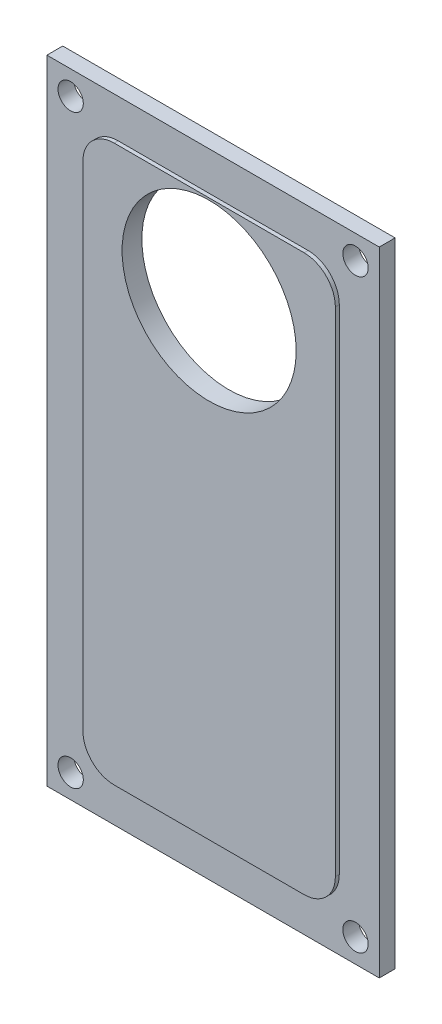
ISO-10303-21;
HEADER;
FILE_DESCRIPTION(('STEP AP214'),'2;1');
FILE_NAME('part.step','',(''),(''),'','','');
FILE_SCHEMA(('AUTOMOTIVE_DESIGN { 1 0 10303 214 1 1 1 1 }'));
ENDSEC;
DATA;
#1=APPLICATION_CONTEXT('core data for automotive mechanical design processes');
#2=APPLICATION_PROTOCOL_DEFINITION('international standard','automotive_design',2000,#1);
#3=PRODUCT_CONTEXT('',#1,'mechanical');
#4=PRODUCT('Part','Part','',(#3));
#5=PRODUCT_RELATED_PRODUCT_CATEGORY('part','',(#4));
#6=PRODUCT_DEFINITION_FORMATION('','',#4);
#7=PRODUCT_DEFINITION_CONTEXT('part definition',#1,'design');
#8=PRODUCT_DEFINITION('design','',#6,#7);
#9=PRODUCT_DEFINITION_SHAPE('','',#8);
#10=(LENGTH_UNIT() NAMED_UNIT(*) SI_UNIT(.MILLI.,.METRE.));
#11=(NAMED_UNIT(*) PLANE_ANGLE_UNIT() SI_UNIT($,.RADIAN.));
#12=(NAMED_UNIT(*) SI_UNIT($,.STERADIAN.) SOLID_ANGLE_UNIT());
#13=UNCERTAINTY_MEASURE_WITH_UNIT(LENGTH_MEASURE(1.E-05),#10,'distance_accuracy_value','');
#14=(GEOMETRIC_REPRESENTATION_CONTEXT(3) GLOBAL_UNCERTAINTY_ASSIGNED_CONTEXT((#13)) GLOBAL_UNIT_ASSIGNED_CONTEXT((#10,
#11,#12)) REPRESENTATION_CONTEXT('',''));
#15=CARTESIAN_POINT('',(0.,0.,0.));
#16=DIRECTION('',(0.,0.,1.));
#17=DIRECTION('',(1.,0.,0.));
#18=AXIS2_PLACEMENT_3D('',#15,#16,#17);
#19=CARTESIAN_POINT('',(21.,40.,2.));
#20=DIRECTION('',(-1.,0.,0.));
#21=DIRECTION('',(0.,-1.,0.));
#22=AXIS2_PLACEMENT_3D('',#19,#20,#21);
#23=PLANE('',#22);
#24=DIRECTION('',(0.,1.,0.));
#25=VECTOR('',#24,1.);
#26=CARTESIAN_POINT('',(21.,40.,0.));
#27=LINE('',#26,#25);
#28=CARTESIAN_POINT('',(21.,-40.,0.));
#29=VERTEX_POINT('',#28);
#30=CARTESIAN_POINT('',(21.,40.,0.));
#31=VERTEX_POINT('',#30);
#32=EDGE_CURVE('E152',#29,#31,#27,.T.);
#33=ORIENTED_EDGE('',*,*,#32,.T.);
#34=DIRECTION('',(0.,0.,-1.));
#35=VECTOR('',#34,1.);
#36=CARTESIAN_POINT('',(21.,40.,2.));
#37=LINE('',#36,#35);
#38=CARTESIAN_POINT('',(21.,40.,2.));
#39=VERTEX_POINT('',#38);
#40=EDGE_CURVE('E131',#39,#31,#37,.T.);
#41=ORIENTED_EDGE('',*,*,#40,.F.);
#42=DIRECTION('',(0.,1.,0.));
#43=VECTOR('',#42,1.);
#44=CARTESIAN_POINT('',(21.,40.,2.));
#45=LINE('',#44,#43);
#46=CARTESIAN_POINT('',(21.,-40.,2.));
#47=VERTEX_POINT('',#46);
#48=EDGE_CURVE('E139',#47,#39,#45,.T.);
#49=ORIENTED_EDGE('',*,*,#48,.F.);
#50=DIRECTION('',(0.,0.,-1.));
#51=VECTOR('',#50,1.);
#52=CARTESIAN_POINT('',(21.,-40.,2.));
#53=LINE('',#52,#51);
#54=EDGE_CURVE('E257',#47,#29,#53,.T.);
#55=ORIENTED_EDGE('',*,*,#54,.T.);
#56=EDGE_LOOP('',(#33,#41,#49,#55));
#57=FACE_BOUND('',#56,.T.);
#58=ADVANCED_FACE('F38',(#57),#23,.F.);
#59=CARTESIAN_POINT('',(-21.,40.,2.));
#60=DIRECTION('',(0.,-1.,0.));
#61=DIRECTION('',(0.,0.,-1.));
#62=AXIS2_PLACEMENT_3D('',#59,#60,#61);
#63=PLANE('',#62);
#64=DIRECTION('',(-1.,0.,0.));
#65=VECTOR('',#64,1.);
#66=CARTESIAN_POINT('',(-21.,40.,0.));
#67=LINE('',#66,#65);
#68=CARTESIAN_POINT('',(-21.,40.,0.));
#69=VERTEX_POINT('',#68);
#70=EDGE_CURVE('E260',#31,#69,#67,.T.);
#71=ORIENTED_EDGE('',*,*,#70,.T.);
#72=DIRECTION('',(0.,0.,-1.));
#73=VECTOR('',#72,1.);
#74=CARTESIAN_POINT('',(-21.,40.,2.));
#75=LINE('',#74,#73);
#76=CARTESIAN_POINT('',(-21.,40.,2.));
#77=VERTEX_POINT('',#76);
#78=EDGE_CURVE('E134',#77,#69,#75,.T.);
#79=ORIENTED_EDGE('',*,*,#78,.F.);
#80=DIRECTION('',(-1.,0.,0.));
#81=VECTOR('',#80,1.);
#82=CARTESIAN_POINT('',(-21.,40.,2.));
#83=LINE('',#82,#81);
#84=EDGE_CURVE('E127',#39,#77,#83,.T.);
#85=ORIENTED_EDGE('',*,*,#84,.F.);
#86=ORIENTED_EDGE('',*,*,#40,.T.);
#87=EDGE_LOOP('',(#71,#79,#85,#86));
#88=FACE_BOUND('',#87,.T.);
#89=ADVANCED_FACE('F129',(#88),#63,.F.);
#90=CARTESIAN_POINT('',(-21.,40.,2.));
#91=DIRECTION('',(1.,0.,0.));
#92=DIRECTION('',(0.,1.,0.));
#93=AXIS2_PLACEMENT_3D('',#90,#91,#92);
#94=PLANE('',#93);
#95=DIRECTION('',(0.,-1.,0.));
#96=VECTOR('',#95,1.);
#97=CARTESIAN_POINT('',(-21.,40.,0.));
#98=LINE('',#97,#96);
#99=CARTESIAN_POINT('',(-21.,-40.,0.));
#100=VERTEX_POINT('',#99);
#101=EDGE_CURVE('E263',#69,#100,#98,.T.);
#102=ORIENTED_EDGE('',*,*,#101,.T.);
#103=DIRECTION('',(0.,0.,-1.));
#104=VECTOR('',#103,1.);
#105=CARTESIAN_POINT('',(-21.,-40.,2.));
#106=LINE('',#105,#104);
#107=CARTESIAN_POINT('',(-21.,-40.,2.));
#108=VERTEX_POINT('',#107);
#109=EDGE_CURVE('E160',#108,#100,#106,.T.);
#110=ORIENTED_EDGE('',*,*,#109,.F.);
#111=DIRECTION('',(0.,-1.,0.));
#112=VECTOR('',#111,1.);
#113=CARTESIAN_POINT('',(-21.,40.,2.));
#114=LINE('',#113,#112);
#115=EDGE_CURVE('E138',#77,#108,#114,.T.);
#116=ORIENTED_EDGE('',*,*,#115,.F.);
#117=ORIENTED_EDGE('',*,*,#78,.T.);
#118=EDGE_LOOP('',(#102,#110,#116,#117));
#119=FACE_BOUND('',#118,.T.);
#120=ADVANCED_FACE('F279',(#119),#94,.F.);
#121=CARTESIAN_POINT('',(-21.,-40.,2.));
#122=DIRECTION('',(0.,1.,0.));
#123=DIRECTION('',(0.,0.,1.));
#124=AXIS2_PLACEMENT_3D('',#121,#122,#123);
#125=PLANE('',#124);
#126=DIRECTION('',(1.,0.,0.));
#127=VECTOR('',#126,1.);
#128=CARTESIAN_POINT('',(-21.,-40.,0.));
#129=LINE('',#128,#127);
#130=EDGE_CURVE('E149',#100,#29,#129,.T.);
#131=ORIENTED_EDGE('',*,*,#130,.T.);
#132=ORIENTED_EDGE('',*,*,#54,.F.);
#133=DIRECTION('',(1.,0.,0.));
#134=VECTOR('',#133,1.);
#135=CARTESIAN_POINT('',(-21.,-40.,2.));
#136=LINE('',#135,#134);
#137=EDGE_CURVE('E144',#108,#47,#136,.T.);
#138=ORIENTED_EDGE('',*,*,#137,.F.);
#139=ORIENTED_EDGE('',*,*,#109,.T.);
#140=EDGE_LOOP('',(#131,#132,#138,#139));
#141=FACE_BOUND('',#140,.T.);
#142=ADVANCED_FACE('F274',(#141),#125,.F.);
#143=CARTESIAN_POINT('',(0.,0.,2.));
#144=DIRECTION('',(0.,0.,1.));
#145=DIRECTION('',(1.,0.,0.));
#146=AXIS2_PLACEMENT_3D('',#143,#144,#145);
#147=PLANE('',#146);
#148=CARTESIAN_POINT('',(-18.,-37.,2.));
#149=DIRECTION('',(0.,0.,1.));
#150=DIRECTION('',(1.,0.,0.));
#151=AXIS2_PLACEMENT_3D('',#148,#149,#150);
#152=CIRCLE('',#151,1.6);
#153=CARTESIAN_POINT('',(-16.4,-37.,2.));
#154=VERTEX_POINT('',#153);
#155=EDGE_CURVE('E369',#154,#154,#152,.T.);
#156=ORIENTED_EDGE('',*,*,#155,.F.);
#157=EDGE_LOOP('',(#156));
#158=FACE_BOUND('',#157,.T.);
#159=CARTESIAN_POINT('',(18.,-37.,2.));
#160=DIRECTION('',(0.,0.,1.));
#161=DIRECTION('',(1.,0.,0.));
#162=AXIS2_PLACEMENT_3D('',#159,#160,#161);
#163=CIRCLE('',#162,1.6);
#164=CARTESIAN_POINT('',(19.6,-37.,2.));
#165=VERTEX_POINT('',#164);
#166=EDGE_CURVE('E374',#165,#165,#163,.T.);
#167=ORIENTED_EDGE('',*,*,#166,.F.);
#168=EDGE_LOOP('',(#167));
#169=FACE_BOUND('',#168,.T.);
#170=CARTESIAN_POINT('',(18.,37.,2.));
#171=DIRECTION('',(0.,0.,1.));
#172=DIRECTION('',(1.,0.,0.));
#173=AXIS2_PLACEMENT_3D('',#170,#171,#172);
#174=CIRCLE('',#173,1.6);
#175=CARTESIAN_POINT('',(19.6,37.,2.));
#176=VERTEX_POINT('',#175);
#177=EDGE_CURVE('E378',#176,#176,#174,.T.);
#178=ORIENTED_EDGE('',*,*,#177,.F.);
#179=EDGE_LOOP('',(#178));
#180=FACE_BOUND('',#179,.T.);
#181=CARTESIAN_POINT('',(-18.,37.,2.));
#182=DIRECTION('',(0.,0.,1.));
#183=DIRECTION('',(1.,0.,0.));
#184=AXIS2_PLACEMENT_3D('',#181,#182,#183);
#185=CIRCLE('',#184,1.6);
#186=CARTESIAN_POINT('',(-16.4,37.,2.));
#187=VERTEX_POINT('',#186);
#188=EDGE_CURVE('E382',#187,#187,#185,.T.);
#189=ORIENTED_EDGE('',*,*,#188,.F.);
#190=EDGE_LOOP('',(#189));
#191=FACE_BOUND('',#190,.T.);
#192=DIRECTION('',(0.,1.,0.));
#193=VECTOR('',#192,1.);
#194=CARTESIAN_POINT('',(15.95,35.125,2.));
#195=LINE('',#194,#193);
#196=CARTESIAN_POINT('',(15.95,-31.175,2.));
#197=VERTEX_POINT('',#196);
#198=CARTESIAN_POINT('',(15.95,31.175,2.));
#199=VERTEX_POINT('',#198);
#200=EDGE_CURVE('E207',#197,#199,#195,.T.);
#201=ORIENTED_EDGE('',*,*,#200,.F.);
#202=CARTESIAN_POINT('',(12.,-31.175,2.));
#203=DIRECTION('',(0.,0.,1.));
#204=DIRECTION('',(1.,0.,0.));
#205=AXIS2_PLACEMENT_3D('',#202,#203,#204);
#206=CIRCLE('',#205,3.95);
#207=CARTESIAN_POINT('',(12.,-35.125,2.));
#208=VERTEX_POINT('',#207);
#209=EDGE_CURVE('E199',#197,#208,#206,.F.);
#210=ORIENTED_EDGE('',*,*,#209,.T.);
#211=DIRECTION('',(1.,0.,0.));
#212=VECTOR('',#211,1.);
#213=CARTESIAN_POINT('',(-15.95,-35.125,2.));
#214=LINE('',#213,#212);
#215=CARTESIAN_POINT('',(-12.,-35.125,2.));
#216=VERTEX_POINT('',#215);
#217=EDGE_CURVE('E238',#216,#208,#214,.T.);
#218=ORIENTED_EDGE('',*,*,#217,.F.);
#219=CARTESIAN_POINT('',(-12.,-31.175,2.));
#220=DIRECTION('',(0.,0.,1.));
#221=DIRECTION('',(1.,0.,0.));
#222=AXIS2_PLACEMENT_3D('',#219,#220,#221);
#223=CIRCLE('',#222,3.95);
#224=CARTESIAN_POINT('',(-15.95,-31.175,2.));
#225=VERTEX_POINT('',#224);
#226=EDGE_CURVE('E202',#216,#225,#223,.F.);
#227=ORIENTED_EDGE('',*,*,#226,.T.);
#228=DIRECTION('',(0.,-1.,0.));
#229=VECTOR('',#228,1.);
#230=CARTESIAN_POINT('',(-15.95,35.125,2.));
#231=LINE('',#230,#229);
#232=CARTESIAN_POINT('',(-15.95,31.175,2.));
#233=VERTEX_POINT('',#232);
#234=EDGE_CURVE('E246',#233,#225,#231,.T.);
#235=ORIENTED_EDGE('',*,*,#234,.F.);
#236=CARTESIAN_POINT('',(-12.,31.175,2.));
#237=DIRECTION('',(0.,0.,1.));
#238=DIRECTION('',(1.,0.,0.));
#239=AXIS2_PLACEMENT_3D('',#236,#237,#238);
#240=CIRCLE('',#239,3.95);
#241=CARTESIAN_POINT('',(-12.,35.125,2.));
#242=VERTEX_POINT('',#241);
#243=EDGE_CURVE('E11',#233,#242,#240,.F.);
#244=ORIENTED_EDGE('',*,*,#243,.T.);
#245=DIRECTION('',(-1.,0.,0.));
#246=VECTOR('',#245,1.);
#247=CARTESIAN_POINT('',(-15.95,35.125,2.));
#248=LINE('',#247,#246);
#249=CARTESIAN_POINT('',(12.,35.125,2.));
#250=VERTEX_POINT('',#249);
#251=EDGE_CURVE('E208',#250,#242,#248,.T.);
#252=ORIENTED_EDGE('',*,*,#251,.F.);
#253=CARTESIAN_POINT('',(12.,31.175,2.));
#254=DIRECTION('',(0.,0.,1.));
#255=DIRECTION('',(1.,0.,0.));
#256=AXIS2_PLACEMENT_3D('',#253,#254,#255);
#257=CIRCLE('',#256,3.95);
#258=EDGE_CURVE('E47',#250,#199,#257,.F.);
#259=ORIENTED_EDGE('',*,*,#258,.T.);
#260=EDGE_LOOP('',(#201,#210,#218,#227,#235,#244,#252,#259));
#261=FACE_BOUND('',#260,.T.);
#262=ORIENTED_EDGE('',*,*,#48,.T.);
#263=ORIENTED_EDGE('',*,*,#84,.T.);
#264=ORIENTED_EDGE('',*,*,#115,.T.);
#265=ORIENTED_EDGE('',*,*,#137,.T.);
#266=EDGE_LOOP('',(#262,#263,#264,#265));
#267=FACE_BOUND('',#266,.T.);
#268=ADVANCED_FACE('F142',(#158,#169,#180,#191,#261,#267),#147,.T.);
#269=CARTESIAN_POINT('',(0.,0.,0.));
#270=DIRECTION('',(0.,0.,1.));
#271=DIRECTION('',(1.,0.,0.));
#272=AXIS2_PLACEMENT_3D('',#269,#270,#271);
#273=PLANE('',#272);
#274=CARTESIAN_POINT('',(-18.,-37.,0.));
#275=DIRECTION('',(0.,0.,-1.));
#276=DIRECTION('',(-1.,0.,0.));
#277=AXIS2_PLACEMENT_3D('',#274,#275,#276);
#278=CIRCLE('',#277,1.6);
#279=CARTESIAN_POINT('',(-19.6,-37.,0.));
#280=VERTEX_POINT('',#279);
#281=EDGE_CURVE('E349',#280,#280,#278,.T.);
#282=ORIENTED_EDGE('',*,*,#281,.F.);
#283=EDGE_LOOP('',(#282));
#284=FACE_BOUND('',#283,.T.);
#285=CARTESIAN_POINT('',(18.,-37.,0.));
#286=DIRECTION('',(0.,0.,-1.));
#287=DIRECTION('',(-1.,0.,0.));
#288=AXIS2_PLACEMENT_3D('',#285,#286,#287);
#289=CIRCLE('',#288,1.6);
#290=CARTESIAN_POINT('',(16.4,-37.,0.));
#291=VERTEX_POINT('',#290);
#292=EDGE_CURVE('E353',#291,#291,#289,.T.);
#293=ORIENTED_EDGE('',*,*,#292,.F.);
#294=EDGE_LOOP('',(#293));
#295=FACE_BOUND('',#294,.T.);
#296=CARTESIAN_POINT('',(18.,37.,0.));
#297=DIRECTION('',(0.,0.,-1.));
#298=DIRECTION('',(-1.,0.,0.));
#299=AXIS2_PLACEMENT_3D('',#296,#297,#298);
#300=CIRCLE('',#299,1.6);
#301=CARTESIAN_POINT('',(16.4,37.,0.));
#302=VERTEX_POINT('',#301);
#303=EDGE_CURVE('E357',#302,#302,#300,.T.);
#304=ORIENTED_EDGE('',*,*,#303,.F.);
#305=EDGE_LOOP('',(#304));
#306=FACE_BOUND('',#305,.T.);
#307=CARTESIAN_POINT('',(-18.,37.,0.));
#308=DIRECTION('',(0.,0.,-1.));
#309=DIRECTION('',(-1.,0.,0.));
#310=AXIS2_PLACEMENT_3D('',#307,#308,#309);
#311=CIRCLE('',#310,1.6);
#312=CARTESIAN_POINT('',(-19.6,37.,0.));
#313=VERTEX_POINT('',#312);
#314=EDGE_CURVE('E361',#313,#313,#311,.T.);
#315=ORIENTED_EDGE('',*,*,#314,.F.);
#316=EDGE_LOOP('',(#315));
#317=FACE_BOUND('',#316,.T.);
#318=CARTESIAN_POINT('',(0.,23.875,0.));
#319=DIRECTION('',(0.,0.,1.));
#320=DIRECTION('',(1.,0.,0.));
#321=AXIS2_PLACEMENT_3D('',#318,#319,#320);
#322=CIRCLE('',#321,11.);
#323=CARTESIAN_POINT('',(11.,23.875,0.));
#324=VERTEX_POINT('',#323);
#325=EDGE_CURVE('E215',#324,#324,#322,.T.);
#326=ORIENTED_EDGE('',*,*,#325,.T.);
#327=EDGE_LOOP('',(#326));
#328=FACE_BOUND('',#327,.T.);
#329=ORIENTED_EDGE('',*,*,#32,.F.);
#330=ORIENTED_EDGE('',*,*,#130,.F.);
#331=ORIENTED_EDGE('',*,*,#101,.F.);
#332=ORIENTED_EDGE('',*,*,#70,.F.);
#333=EDGE_LOOP('',(#329,#330,#331,#332));
#334=FACE_BOUND('',#333,.T.);
#335=ADVANCED_FACE('F278',(#284,#295,#306,#317,#328,#334),#273,.F.);
#336=CARTESIAN_POINT('',(15.95,35.125,2.5));
#337=DIRECTION('',(-1.,0.,0.));
#338=DIRECTION('',(0.,-1.,0.));
#339=AXIS2_PLACEMENT_3D('',#336,#337,#338);
#340=PLANE('',#339);
#341=DIRECTION('',(0.,1.,0.));
#342=VECTOR('',#341,1.);
#343=CARTESIAN_POINT('',(15.95,35.125,2.5));
#344=LINE('',#343,#342);
#345=CARTESIAN_POINT('',(15.95,-31.175,2.5));
#346=VERTEX_POINT('',#345);
#347=CARTESIAN_POINT('',(15.95,31.175,2.5));
#348=VERTEX_POINT('',#347);
#349=EDGE_CURVE('E226',#346,#348,#344,.T.);
#350=ORIENTED_EDGE('',*,*,#349,.F.);
#351=DIRECTION('',(0.,0.,-1.));
#352=VECTOR('',#351,1.);
#353=CARTESIAN_POINT('',(15.95,-31.175,2.5));
#354=LINE('',#353,#352);
#355=EDGE_CURVE('E158',#346,#197,#354,.T.);
#356=ORIENTED_EDGE('',*,*,#355,.T.);
#357=ORIENTED_EDGE('',*,*,#200,.T.);
#358=DIRECTION('',(0.,0.,-1.));
#359=VECTOR('',#358,1.);
#360=CARTESIAN_POINT('',(15.95,31.175,2.5));
#361=LINE('',#360,#359);
#362=EDGE_CURVE('E154',#199,#348,#361,.F.);
#363=ORIENTED_EDGE('',*,*,#362,.T.);
#364=EDGE_LOOP('',(#350,#356,#357,#363));
#365=FACE_BOUND('',#364,.T.);
#366=ADVANCED_FACE('F211',(#365),#340,.F.);
#367=CARTESIAN_POINT('',(-15.95,35.125,2.5));
#368=DIRECTION('',(0.,-1.,0.));
#369=DIRECTION('',(0.,0.,-1.));
#370=AXIS2_PLACEMENT_3D('',#367,#368,#369);
#371=PLANE('',#370);
#372=DIRECTION('',(-1.,0.,0.));
#373=VECTOR('',#372,1.);
#374=CARTESIAN_POINT('',(-15.95,35.125,2.5));
#375=LINE('',#374,#373);
#376=CARTESIAN_POINT('',(12.,35.125,2.5));
#377=VERTEX_POINT('',#376);
#378=CARTESIAN_POINT('',(-12.,35.125,2.5));
#379=VERTEX_POINT('',#378);
#380=EDGE_CURVE('E224',#377,#379,#375,.T.);
#381=ORIENTED_EDGE('',*,*,#380,.F.);
#382=DIRECTION('',(0.,0.,-1.));
#383=VECTOR('',#382,1.);
#384=CARTESIAN_POINT('',(12.,35.125,2.5));
#385=LINE('',#384,#383);
#386=EDGE_CURVE('E196',#377,#250,#385,.T.);
#387=ORIENTED_EDGE('',*,*,#386,.T.);
#388=ORIENTED_EDGE('',*,*,#251,.T.);
#389=DIRECTION('',(0.,0.,-1.));
#390=VECTOR('',#389,1.);
#391=CARTESIAN_POINT('',(-12.,35.125,2.5));
#392=LINE('',#391,#390);
#393=EDGE_CURVE('E193',#242,#379,#392,.F.);
#394=ORIENTED_EDGE('',*,*,#393,.T.);
#395=EDGE_LOOP('',(#381,#387,#388,#394));
#396=FACE_BOUND('',#395,.T.);
#397=ADVANCED_FACE('F228',(#396),#371,.F.);
#398=CARTESIAN_POINT('',(-15.95,35.125,2.5));
#399=DIRECTION('',(1.,0.,0.));
#400=DIRECTION('',(0.,1.,0.));
#401=AXIS2_PLACEMENT_3D('',#398,#399,#400);
#402=PLANE('',#401);
#403=ORIENTED_EDGE('',*,*,#234,.T.);
#404=DIRECTION('',(0.,0.,-1.));
#405=VECTOR('',#404,1.);
#406=CARTESIAN_POINT('',(-15.95,-31.175,2.5));
#407=LINE('',#406,#405);
#408=CARTESIAN_POINT('',(-15.95,-31.175,2.5));
#409=VERTEX_POINT('',#408);
#410=EDGE_CURVE('E190',#225,#409,#407,.F.);
#411=ORIENTED_EDGE('',*,*,#410,.T.);
#412=DIRECTION('',(0.,-1.,0.));
#413=VECTOR('',#412,1.);
#414=CARTESIAN_POINT('',(-15.95,35.125,2.5));
#415=LINE('',#414,#413);
#416=CARTESIAN_POINT('',(-15.95,31.175,2.5));
#417=VERTEX_POINT('',#416);
#418=EDGE_CURVE('E231',#417,#409,#415,.T.);
#419=ORIENTED_EDGE('',*,*,#418,.F.);
#420=DIRECTION('',(0.,0.,-1.));
#421=VECTOR('',#420,1.);
#422=CARTESIAN_POINT('',(-15.95,31.175,2.5));
#423=LINE('',#422,#421);
#424=EDGE_CURVE('E186',#417,#233,#423,.T.);
#425=ORIENTED_EDGE('',*,*,#424,.T.);
#426=EDGE_LOOP('',(#403,#411,#419,#425));
#427=FACE_BOUND('',#426,.T.);
#428=ADVANCED_FACE('F316',(#427),#402,.F.);
#429=CARTESIAN_POINT('',(-15.95,-35.125,2.5));
#430=DIRECTION('',(0.,1.,0.));
#431=DIRECTION('',(0.,0.,1.));
#432=AXIS2_PLACEMENT_3D('',#429,#430,#431);
#433=PLANE('',#432);
#434=ORIENTED_EDGE('',*,*,#217,.T.);
#435=DIRECTION('',(0.,0.,-1.));
#436=VECTOR('',#435,1.);
#437=CARTESIAN_POINT('',(12.,-35.125,2.5));
#438=LINE('',#437,#436);
#439=CARTESIAN_POINT('',(12.,-35.125,2.5));
#440=VERTEX_POINT('',#439);
#441=EDGE_CURVE('E171',#208,#440,#438,.F.);
#442=ORIENTED_EDGE('',*,*,#441,.T.);
#443=DIRECTION('',(1.,0.,0.));
#444=VECTOR('',#443,1.);
#445=CARTESIAN_POINT('',(-15.95,-35.125,2.5));
#446=LINE('',#445,#444);
#447=CARTESIAN_POINT('',(-12.,-35.125,2.5));
#448=VERTEX_POINT('',#447);
#449=EDGE_CURVE('E236',#448,#440,#446,.T.);
#450=ORIENTED_EDGE('',*,*,#449,.F.);
#451=DIRECTION('',(0.,0.,-1.));
#452=VECTOR('',#451,1.);
#453=CARTESIAN_POINT('',(-12.,-35.125,2.5));
#454=LINE('',#453,#452);
#455=EDGE_CURVE('E167',#448,#216,#454,.T.);
#456=ORIENTED_EDGE('',*,*,#455,.T.);
#457=EDGE_LOOP('',(#434,#442,#450,#456));
#458=FACE_BOUND('',#457,.T.);
#459=ADVANCED_FACE('F322',(#458),#433,.F.);
#460=CARTESIAN_POINT('',(0.,0.,2.5));
#461=DIRECTION('',(0.,0.,1.));
#462=DIRECTION('',(1.,0.,0.));
#463=AXIS2_PLACEMENT_3D('',#460,#461,#462);
#464=PLANE('',#463);
#465=CARTESIAN_POINT('',(0.,23.875,2.5));
#466=DIRECTION('',(0.,0.,1.));
#467=DIRECTION('',(1.,0.,0.));
#468=AXIS2_PLACEMENT_3D('',#465,#466,#467);
#469=CIRCLE('',#468,11.);
#470=CARTESIAN_POINT('',(11.,23.875,2.5));
#471=VERTEX_POINT('',#470);
#472=EDGE_CURVE('E365',#471,#471,#469,.T.);
#473=ORIENTED_EDGE('',*,*,#472,.F.);
#474=EDGE_LOOP('',(#473));
#475=FACE_BOUND('',#474,.T.);
#476=ORIENTED_EDGE('',*,*,#449,.T.);
#477=CARTESIAN_POINT('',(12.,-31.175,2.5));
#478=DIRECTION('',(0.,0.,1.));
#479=DIRECTION('',(1.,0.,0.));
#480=AXIS2_PLACEMENT_3D('',#477,#478,#479);
#481=CIRCLE('',#480,3.95);
#482=EDGE_CURVE('E183',#440,#346,#481,.T.);
#483=ORIENTED_EDGE('',*,*,#482,.T.);
#484=ORIENTED_EDGE('',*,*,#349,.T.);
#485=CARTESIAN_POINT('',(12.,31.175,2.5));
#486=DIRECTION('',(0.,0.,1.));
#487=DIRECTION('',(1.,0.,0.));
#488=AXIS2_PLACEMENT_3D('',#485,#486,#487);
#489=CIRCLE('',#488,3.95);
#490=EDGE_CURVE('E177',#348,#377,#489,.T.);
#491=ORIENTED_EDGE('',*,*,#490,.T.);
#492=ORIENTED_EDGE('',*,*,#380,.T.);
#493=CARTESIAN_POINT('',(-12.,31.175,2.5));
#494=DIRECTION('',(0.,0.,1.));
#495=DIRECTION('',(1.,0.,0.));
#496=AXIS2_PLACEMENT_3D('',#493,#494,#495);
#497=CIRCLE('',#496,3.95);
#498=EDGE_CURVE('E174',#379,#417,#497,.T.);
#499=ORIENTED_EDGE('',*,*,#498,.T.);
#500=ORIENTED_EDGE('',*,*,#418,.T.);
#501=CARTESIAN_POINT('',(-12.,-31.175,2.5));
#502=DIRECTION('',(0.,0.,1.));
#503=DIRECTION('',(1.,0.,0.));
#504=AXIS2_PLACEMENT_3D('',#501,#502,#503);
#505=CIRCLE('',#504,3.95);
#506=EDGE_CURVE('E180',#409,#448,#505,.T.);
#507=ORIENTED_EDGE('',*,*,#506,.T.);
#508=EDGE_LOOP('',(#476,#483,#484,#491,#492,#499,#500,#507));
#509=FACE_BOUND('',#508,.T.);
#510=ADVANCED_FACE('F223',(#475,#509),#464,.T.);
#511=CARTESIAN_POINT('',(12.,-31.175,2.5));
#512=DIRECTION('',(0.,0.,-1.));
#513=DIRECTION('',(-1.,0.,0.));
#514=AXIS2_PLACEMENT_3D('',#511,#512,#513);
#515=CYLINDRICAL_SURFACE('',#514,3.95);
#516=ORIENTED_EDGE('',*,*,#482,.F.);
#517=ORIENTED_EDGE('',*,*,#441,.F.);
#518=ORIENTED_EDGE('',*,*,#209,.F.);
#519=ORIENTED_EDGE('',*,*,#355,.F.);
#520=EDGE_LOOP('',(#516,#517,#518,#519));
#521=FACE_BOUND('',#520,.T.);
#522=ADVANCED_FACE('F293',(#521),#515,.T.);
#523=CARTESIAN_POINT('',(-12.,-31.175,2.5));
#524=DIRECTION('',(0.,0.,-1.));
#525=DIRECTION('',(-1.,0.,0.));
#526=AXIS2_PLACEMENT_3D('',#523,#524,#525);
#527=CYLINDRICAL_SURFACE('',#526,3.95);
#528=ORIENTED_EDGE('',*,*,#506,.F.);
#529=ORIENTED_EDGE('',*,*,#410,.F.);
#530=ORIENTED_EDGE('',*,*,#226,.F.);
#531=ORIENTED_EDGE('',*,*,#455,.F.);
#532=EDGE_LOOP('',(#528,#529,#530,#531));
#533=FACE_BOUND('',#532,.T.);
#534=ADVANCED_FACE('F296',(#533),#527,.T.);
#535=CARTESIAN_POINT('',(12.,31.175,2.5));
#536=DIRECTION('',(0.,0.,-1.));
#537=DIRECTION('',(-1.,0.,0.));
#538=AXIS2_PLACEMENT_3D('',#535,#536,#537);
#539=CYLINDRICAL_SURFACE('',#538,3.95);
#540=ORIENTED_EDGE('',*,*,#490,.F.);
#541=ORIENTED_EDGE('',*,*,#362,.F.);
#542=ORIENTED_EDGE('',*,*,#258,.F.);
#543=ORIENTED_EDGE('',*,*,#386,.F.);
#544=EDGE_LOOP('',(#540,#541,#542,#543));
#545=FACE_BOUND('',#544,.T.);
#546=ADVANCED_FACE('F218',(#545),#539,.T.);
#547=CARTESIAN_POINT('',(-12.,31.175,2.5));
#548=DIRECTION('',(0.,0.,-1.));
#549=DIRECTION('',(-1.,0.,0.));
#550=AXIS2_PLACEMENT_3D('',#547,#548,#549);
#551=CYLINDRICAL_SURFACE('',#550,3.95);
#552=ORIENTED_EDGE('',*,*,#498,.F.);
#553=ORIENTED_EDGE('',*,*,#393,.F.);
#554=ORIENTED_EDGE('',*,*,#243,.F.);
#555=ORIENTED_EDGE('',*,*,#424,.F.);
#556=EDGE_LOOP('',(#552,#553,#554,#555));
#557=FACE_BOUND('',#556,.T.);
#558=ADVANCED_FACE('F40',(#557),#551,.T.);
#559=CARTESIAN_POINT('',(0.,23.875,0.));
#560=DIRECTION('',(0.,0.,1.));
#561=DIRECTION('',(1.,0.,0.));
#562=AXIS2_PLACEMENT_3D('',#559,#560,#561);
#563=CYLINDRICAL_SURFACE('',#562,11.);
#564=ORIENTED_EDGE('',*,*,#325,.F.);
#565=EDGE_LOOP('',(#564));
#566=FACE_BOUND('',#565,.T.);
#567=ORIENTED_EDGE('',*,*,#472,.T.);
#568=EDGE_LOOP('',(#567));
#569=FACE_BOUND('',#568,.T.);
#570=ADVANCED_FACE('F304',(#566,#569),#563,.F.);
#571=CARTESIAN_POINT('',(-18.,37.,2.5));
#572=DIRECTION('',(0.,0.,-1.));
#573=DIRECTION('',(-1.,0.,0.));
#574=AXIS2_PLACEMENT_3D('',#571,#572,#573);
#575=CYLINDRICAL_SURFACE('',#574,1.6);
#576=ORIENTED_EDGE('',*,*,#188,.T.);
#577=EDGE_LOOP('',(#576));
#578=FACE_BOUND('',#577,.T.);
#579=ORIENTED_EDGE('',*,*,#314,.T.);
#580=EDGE_LOOP('',(#579));
#581=FACE_BOUND('',#580,.T.);
#582=ADVANCED_FACE('F309',(#578,#581),#575,.F.);
#583=CARTESIAN_POINT('',(18.,37.,2.5));
#584=DIRECTION('',(0.,0.,-1.));
#585=DIRECTION('',(-1.,0.,0.));
#586=AXIS2_PLACEMENT_3D('',#583,#584,#585);
#587=CYLINDRICAL_SURFACE('',#586,1.6);
#588=ORIENTED_EDGE('',*,*,#177,.T.);
#589=EDGE_LOOP('',(#588));
#590=FACE_BOUND('',#589,.T.);
#591=ORIENTED_EDGE('',*,*,#303,.T.);
#592=EDGE_LOOP('',(#591));
#593=FACE_BOUND('',#592,.T.);
#594=ADVANCED_FACE('F394',(#590,#593),#587,.F.);
#595=CARTESIAN_POINT('',(18.,-37.,2.5));
#596=DIRECTION('',(0.,0.,-1.));
#597=DIRECTION('',(-1.,0.,0.));
#598=AXIS2_PLACEMENT_3D('',#595,#596,#597);
#599=CYLINDRICAL_SURFACE('',#598,1.6);
#600=ORIENTED_EDGE('',*,*,#166,.T.);
#601=EDGE_LOOP('',(#600));
#602=FACE_BOUND('',#601,.T.);
#603=ORIENTED_EDGE('',*,*,#292,.T.);
#604=EDGE_LOOP('',(#603));
#605=FACE_BOUND('',#604,.T.);
#606=ADVANCED_FACE('F396',(#602,#605),#599,.F.);
#607=CARTESIAN_POINT('',(-18.,-37.,2.5));
#608=DIRECTION('',(0.,0.,-1.));
#609=DIRECTION('',(-1.,0.,0.));
#610=AXIS2_PLACEMENT_3D('',#607,#608,#609);
#611=CYLINDRICAL_SURFACE('',#610,1.6);
#612=ORIENTED_EDGE('',*,*,#155,.T.);
#613=EDGE_LOOP('',(#612));
#614=FACE_BOUND('',#613,.T.);
#615=ORIENTED_EDGE('',*,*,#281,.T.);
#616=EDGE_LOOP('',(#615));
#617=FACE_BOUND('',#616,.T.);
#618=ADVANCED_FACE('F403',(#614,#617),#611,.F.);
#619=CLOSED_SHELL('',(#58,#89,#120,#142,#268,#335,#366,#397,#428,#459,#510,#522,#534,#546,#558,
#570,#582,#594,#606,#618));
#620=MANIFOLD_SOLID_BREP('B2',#619);
#621=ADVANCED_BREP_SHAPE_REPRESENTATION('',(#18,#620),#14);
#622=SHAPE_DEFINITION_REPRESENTATION(#9,#621);
ENDSEC;
END-ISO-10303-21;
